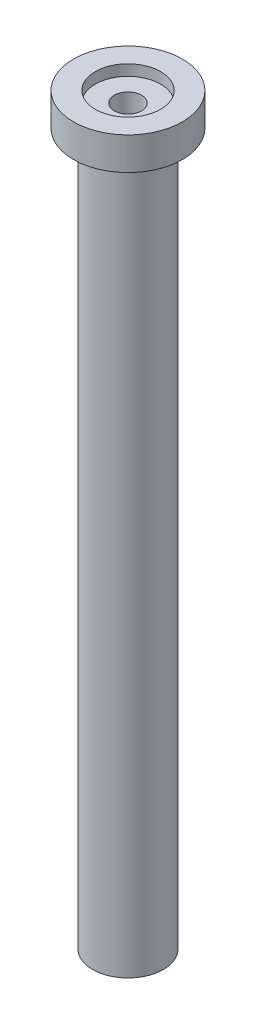
ISO-10303-21;
HEADER;
FILE_DESCRIPTION(('STEP AP214'),'2;1');
FILE_NAME('part.step','',(''),(''),'','','');
FILE_SCHEMA(('AUTOMOTIVE_DESIGN { 1 0 10303 214 1 1 1 1 }'));
ENDSEC;
DATA;
#1=APPLICATION_CONTEXT('core data for automotive mechanical design processes');
#2=APPLICATION_PROTOCOL_DEFINITION('international standard','automotive_design',2000,#1);
#3=PRODUCT_CONTEXT('',#1,'mechanical');
#4=PRODUCT('Part','Part','',(#3));
#5=PRODUCT_RELATED_PRODUCT_CATEGORY('part','',(#4));
#6=PRODUCT_DEFINITION_FORMATION('','',#4);
#7=PRODUCT_DEFINITION_CONTEXT('part definition',#1,'design');
#8=PRODUCT_DEFINITION('design','',#6,#7);
#9=PRODUCT_DEFINITION_SHAPE('','',#8);
#10=(LENGTH_UNIT() NAMED_UNIT(*) SI_UNIT(.MILLI.,.METRE.));
#11=(NAMED_UNIT(*) PLANE_ANGLE_UNIT() SI_UNIT($,.RADIAN.));
#12=(NAMED_UNIT(*) SI_UNIT($,.STERADIAN.) SOLID_ANGLE_UNIT());
#13=UNCERTAINTY_MEASURE_WITH_UNIT(LENGTH_MEASURE(1.E-05),#10,'distance_accuracy_value','');
#14=(GEOMETRIC_REPRESENTATION_CONTEXT(3) GLOBAL_UNCERTAINTY_ASSIGNED_CONTEXT((#13)) GLOBAL_UNIT_ASSIGNED_CONTEXT((#10,
#11,#12)) REPRESENTATION_CONTEXT('',''));
#15=CARTESIAN_POINT('',(0.,0.,0.));
#16=DIRECTION('',(0.,0.,1.));
#17=DIRECTION('',(1.,0.,0.));
#18=AXIS2_PLACEMENT_3D('',#15,#16,#17);
#19=CARTESIAN_POINT('',(0.,65.3,0.));
#20=DIRECTION('',(0.,-1.,0.));
#21=DIRECTION('',(0.,0.,-1.));
#22=AXIS2_PLACEMENT_3D('',#19,#20,#21);
#23=CYLINDRICAL_SURFACE('',#22,3.25);
#24=CARTESIAN_POINT('',(0.,65.3,0.));
#25=DIRECTION('',(0.,1.,0.));
#26=DIRECTION('',(0.,0.,1.));
#27=AXIS2_PLACEMENT_3D('',#24,#25,#26);
#28=CIRCLE('',#27,3.25);
#29=CARTESIAN_POINT('',(0.,65.3,3.25));
#30=VERTEX_POINT('',#29);
#31=EDGE_CURVE('E10',#30,#30,#28,.T.);
#32=ORIENTED_EDGE('',*,*,#31,.F.);
#33=EDGE_LOOP('',(#32));
#34=FACE_BOUND('',#33,.T.);
#35=CARTESIAN_POINT('',(0.,0.,0.));
#36=DIRECTION('',(0.,1.,0.));
#37=DIRECTION('',(0.,0.,1.));
#38=AXIS2_PLACEMENT_3D('',#35,#36,#37);
#39=CIRCLE('',#38,3.25);
#40=CARTESIAN_POINT('',(0.,0.,3.25));
#41=VERTEX_POINT('',#40);
#42=EDGE_CURVE('E37',#41,#41,#39,.T.);
#43=ORIENTED_EDGE('',*,*,#42,.T.);
#44=EDGE_LOOP('',(#43));
#45=FACE_BOUND('',#44,.T.);
#46=ADVANCED_FACE('F34',(#34,#45),#23,.T.);
#47=CARTESIAN_POINT('',(0.,0.,0.));
#48=DIRECTION('',(0.,1.,0.));
#49=DIRECTION('',(0.,0.,1.));
#50=AXIS2_PLACEMENT_3D('',#47,#48,#49);
#51=PLANE('',#50);
#52=CARTESIAN_POINT('',(0.,0.,0.));
#53=DIRECTION('',(0.,-1.,0.));
#54=DIRECTION('',(0.,0.,-1.));
#55=AXIS2_PLACEMENT_3D('',#52,#53,#54);
#56=CIRCLE('',#55,1.425);
#57=CARTESIAN_POINT('',(0.,0.,-1.425));
#58=VERTEX_POINT('',#57);
#59=EDGE_CURVE('E52',#58,#58,#56,.T.);
#60=ORIENTED_EDGE('',*,*,#59,.F.);
#61=EDGE_LOOP('',(#60));
#62=FACE_BOUND('',#61,.T.);
#63=ORIENTED_EDGE('',*,*,#42,.F.);
#64=EDGE_LOOP('',(#63));
#65=FACE_BOUND('',#64,.T.);
#66=ADVANCED_FACE('F90',(#62,#65),#51,.F.);
#67=CARTESIAN_POINT('',(0.,68.3,0.));
#68=DIRECTION('',(0.,-1.,0.));
#69=DIRECTION('',(0.,0.,-1.));
#70=AXIS2_PLACEMENT_3D('',#67,#68,#69);
#71=CYLINDRICAL_SURFACE('',#70,5.);
#72=CARTESIAN_POINT('',(0.,68.3,0.));
#73=DIRECTION('',(0.,1.,0.));
#74=DIRECTION('',(0.,0.,1.));
#75=AXIS2_PLACEMENT_3D('',#72,#73,#74);
#76=CIRCLE('',#75,5.);
#77=CARTESIAN_POINT('',(0.,68.3,5.));
#78=VERTEX_POINT('',#77);
#79=EDGE_CURVE('E44',#78,#78,#76,.T.);
#80=ORIENTED_EDGE('',*,*,#79,.F.);
#81=EDGE_LOOP('',(#80));
#82=FACE_BOUND('',#81,.T.);
#83=CARTESIAN_POINT('',(0.,65.3,0.));
#84=DIRECTION('',(0.,1.,0.));
#85=DIRECTION('',(0.,0.,1.));
#86=AXIS2_PLACEMENT_3D('',#83,#84,#85);
#87=CIRCLE('',#86,5.);
#88=CARTESIAN_POINT('',(0.,65.3,5.));
#89=VERTEX_POINT('',#88);
#90=EDGE_CURVE('E46',#89,#89,#87,.T.);
#91=ORIENTED_EDGE('',*,*,#90,.T.);
#92=EDGE_LOOP('',(#91));
#93=FACE_BOUND('',#92,.T.);
#94=ADVANCED_FACE('F95',(#82,#93),#71,.T.);
#95=CARTESIAN_POINT('',(0.,68.3,0.));
#96=DIRECTION('',(0.,1.,0.));
#97=DIRECTION('',(0.,0.,1.));
#98=AXIS2_PLACEMENT_3D('',#95,#96,#97);
#99=PLANE('',#98);
#100=CARTESIAN_POINT('',(0.,68.3,0.));
#101=DIRECTION('',(0.,1.,0.));
#102=DIRECTION('',(0.,0.,1.));
#103=AXIS2_PLACEMENT_3D('',#100,#101,#102);
#104=CIRCLE('',#103,3.);
#105=CARTESIAN_POINT('',(0.,68.3,3.));
#106=VERTEX_POINT('',#105);
#107=EDGE_CURVE('E61',#106,#106,#104,.T.);
#108=ORIENTED_EDGE('',*,*,#107,.F.);
#109=EDGE_LOOP('',(#108));
#110=FACE_BOUND('',#109,.T.);
#111=ORIENTED_EDGE('',*,*,#79,.T.);
#112=EDGE_LOOP('',(#111));
#113=FACE_BOUND('',#112,.T.);
#114=ADVANCED_FACE('F103',(#110,#113),#99,.T.);
#115=CARTESIAN_POINT('',(0.,65.3,0.));
#116=DIRECTION('',(0.,1.,0.));
#117=DIRECTION('',(0.,0.,1.));
#118=AXIS2_PLACEMENT_3D('',#115,#116,#117);
#119=PLANE('',#118);
#120=ORIENTED_EDGE('',*,*,#31,.T.);
#121=EDGE_LOOP('',(#120));
#122=FACE_BOUND('',#121,.T.);
#123=ORIENTED_EDGE('',*,*,#90,.F.);
#124=EDGE_LOOP('',(#123));
#125=FACE_BOUND('',#124,.T.);
#126=ADVANCED_FACE('F108',(#122,#125),#119,.F.);
#127=CARTESIAN_POINT('',(0.,9.,0.));
#128=DIRECTION('',(0.,-1.,0.));
#129=DIRECTION('',(0.,0.,-1.));
#130=AXIS2_PLACEMENT_3D('',#127,#128,#129);
#131=CYLINDRICAL_SURFACE('',#130,1.425);
#132=CARTESIAN_POINT('',(0.,9.,0.));
#133=DIRECTION('',(0.,-1.,0.));
#134=DIRECTION('',(0.,0.,-1.));
#135=AXIS2_PLACEMENT_3D('',#132,#133,#134);
#136=CIRCLE('',#135,1.425);
#137=CARTESIAN_POINT('',(0.,9.,-1.425));
#138=VERTEX_POINT('',#137);
#139=EDGE_CURVE('E49',#138,#138,#136,.T.);
#140=ORIENTED_EDGE('',*,*,#139,.F.);
#141=EDGE_LOOP('',(#140));
#142=FACE_BOUND('',#141,.T.);
#143=ORIENTED_EDGE('',*,*,#59,.T.);
#144=EDGE_LOOP('',(#143));
#145=FACE_BOUND('',#144,.T.);
#146=ADVANCED_FACE('F111',(#142,#145),#131,.F.);
#147=CARTESIAN_POINT('',(0.,9.,0.));
#148=DIRECTION('',(0.,-1.,0.));
#149=DIRECTION('',(0.,0.,-1.));
#150=AXIS2_PLACEMENT_3D('',#147,#148,#149);
#151=PLANE('',#150);
#152=ORIENTED_EDGE('',*,*,#139,.T.);
#153=EDGE_LOOP('',(#152));
#154=FACE_BOUND('',#153,.T.);
#155=ADVANCED_FACE('F87',(#154),#151,.T.);
#156=CARTESIAN_POINT('',(0.,65.3,0.));
#157=DIRECTION('',(0.,-1.,0.));
#158=DIRECTION('',(0.,0.,-1.));
#159=AXIS2_PLACEMENT_3D('',#156,#157,#158);
#160=CYLINDRICAL_SURFACE('',#159,1.25);
#161=CARTESIAN_POINT('',(0.,67.3,0.));
#162=DIRECTION('',(0.,1.,0.));
#163=DIRECTION('',(0.,0.,1.));
#164=AXIS2_PLACEMENT_3D('',#161,#162,#163);
#165=CIRCLE('',#164,1.25);
#166=CARTESIAN_POINT('',(0.,67.3,1.25));
#167=VERTEX_POINT('',#166);
#168=EDGE_CURVE('E60',#167,#167,#165,.T.);
#169=ORIENTED_EDGE('',*,*,#168,.T.);
#170=EDGE_LOOP('',(#169));
#171=FACE_BOUND('',#170,.T.);
#172=CARTESIAN_POINT('',(0.,11.,0.));
#173=DIRECTION('',(0.,-1.,0.));
#174=DIRECTION('',(0.,0.,-1.));
#175=AXIS2_PLACEMENT_3D('',#172,#173,#174);
#176=CIRCLE('',#175,1.25);
#177=CARTESIAN_POINT('',(0.,11.,-1.25));
#178=VERTEX_POINT('',#177);
#179=EDGE_CURVE('E55',#178,#178,#176,.F.);
#180=ORIENTED_EDGE('',*,*,#179,.F.);
#181=EDGE_LOOP('',(#180));
#182=FACE_BOUND('',#181,.T.);
#183=ADVANCED_FACE('F70',(#171,#182),#160,.F.);
#184=CARTESIAN_POINT('',(0.,68.3,0.));
#185=DIRECTION('',(0.,-1.,0.));
#186=DIRECTION('',(0.,0.,-1.));
#187=AXIS2_PLACEMENT_3D('',#184,#185,#186);
#188=CYLINDRICAL_SURFACE('',#187,3.);
#189=ORIENTED_EDGE('',*,*,#107,.T.);
#190=EDGE_LOOP('',(#189));
#191=FACE_BOUND('',#190,.T.);
#192=CARTESIAN_POINT('',(0.,67.3,0.));
#193=DIRECTION('',(0.,1.,0.));
#194=DIRECTION('',(0.,0.,1.));
#195=AXIS2_PLACEMENT_3D('',#192,#193,#194);
#196=CIRCLE('',#195,3.);
#197=CARTESIAN_POINT('',(0.,67.3,3.));
#198=VERTEX_POINT('',#197);
#199=EDGE_CURVE('E64',#198,#198,#196,.T.);
#200=ORIENTED_EDGE('',*,*,#199,.F.);
#201=EDGE_LOOP('',(#200));
#202=FACE_BOUND('',#201,.T.);
#203=ADVANCED_FACE('F77',(#191,#202),#188,.F.);
#204=CARTESIAN_POINT('',(0.,67.3,0.));
#205=DIRECTION('',(0.,1.,0.));
#206=DIRECTION('',(0.,0.,1.));
#207=AXIS2_PLACEMENT_3D('',#204,#205,#206);
#208=PLANE('',#207);
#209=ORIENTED_EDGE('',*,*,#168,.F.);
#210=EDGE_LOOP('',(#209));
#211=FACE_BOUND('',#210,.T.);
#212=ORIENTED_EDGE('',*,*,#199,.T.);
#213=EDGE_LOOP('',(#212));
#214=FACE_BOUND('',#213,.T.);
#215=ADVANCED_FACE('F73',(#211,#214),#208,.T.);
#216=CARTESIAN_POINT('',(0.,11.,0.));
#217=DIRECTION('',(0.,-1.,0.));
#218=DIRECTION('',(0.,0.,-1.));
#219=AXIS2_PLACEMENT_3D('',#216,#217,#218);
#220=PLANE('',#219);
#221=ORIENTED_EDGE('',*,*,#179,.T.);
#222=EDGE_LOOP('',(#221));
#223=FACE_BOUND('',#222,.T.);
#224=ADVANCED_FACE('F76',(#223),#220,.F.);
#225=CLOSED_SHELL('',(#46,#66,#94,#114,#126,#146,#155,#183,#203,#215,#224));
#226=MANIFOLD_SOLID_BREP('B2',#225);
#227=ADVANCED_BREP_SHAPE_REPRESENTATION('',(#18,#226),#14);
#228=SHAPE_DEFINITION_REPRESENTATION(#9,#227);
ENDSEC;
END-ISO-10303-21;
